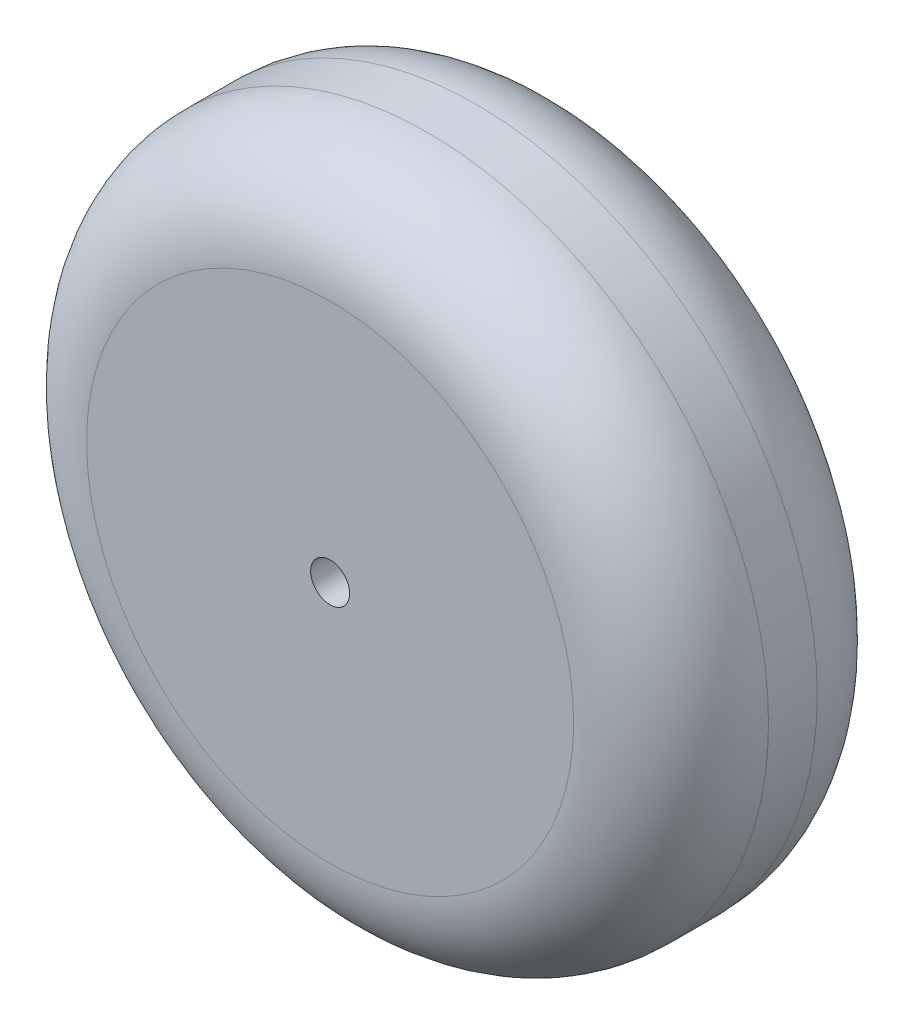
ISO-10303-21;
HEADER;
FILE_DESCRIPTION(('STEP AP214'),'2;1');
FILE_NAME('part.step','',(''),(''),'','','');
FILE_SCHEMA(('AUTOMOTIVE_DESIGN { 1 0 10303 214 1 1 1 1 }'));
ENDSEC;
DATA;
#1=APPLICATION_CONTEXT('core data for automotive mechanical design processes');
#2=APPLICATION_PROTOCOL_DEFINITION('international standard','automotive_design',2000,#1);
#3=PRODUCT_CONTEXT('',#1,'mechanical');
#4=PRODUCT('Part','Part','',(#3));
#5=PRODUCT_RELATED_PRODUCT_CATEGORY('part','',(#4));
#6=PRODUCT_DEFINITION_FORMATION('','',#4);
#7=PRODUCT_DEFINITION_CONTEXT('part definition',#1,'design');
#8=PRODUCT_DEFINITION('design','',#6,#7);
#9=PRODUCT_DEFINITION_SHAPE('','',#8);
#10=(LENGTH_UNIT() NAMED_UNIT(*) SI_UNIT(.MILLI.,.METRE.));
#11=(NAMED_UNIT(*) PLANE_ANGLE_UNIT() SI_UNIT($,.RADIAN.));
#12=(NAMED_UNIT(*) SI_UNIT($,.STERADIAN.) SOLID_ANGLE_UNIT());
#13=UNCERTAINTY_MEASURE_WITH_UNIT(LENGTH_MEASURE(1.E-05),#10,'distance_accuracy_value','');
#14=(GEOMETRIC_REPRESENTATION_CONTEXT(3) GLOBAL_UNCERTAINTY_ASSIGNED_CONTEXT((#13)) GLOBAL_UNIT_ASSIGNED_CONTEXT((#10,
#11,#12)) REPRESENTATION_CONTEXT('',''));
#15=CARTESIAN_POINT('',(0.,0.,0.));
#16=DIRECTION('',(0.,0.,1.));
#17=DIRECTION('',(1.,0.,0.));
#18=AXIS2_PLACEMENT_3D('',#15,#16,#17);
#19=CARTESIAN_POINT('',(0.,0.,25.));
#20=DIRECTION('',(0.,0.,-1.));
#21=DIRECTION('',(-1.,0.,0.));
#22=AXIS2_PLACEMENT_3D('',#19,#20,#21);
#23=CYLINDRICAL_SURFACE('',#22,35.);
#24=CARTESIAN_POINT('',(0.,0.,15.));
#25=DIRECTION('',(0.,0.,1.));
#26=DIRECTION('',(1.,0.,0.));
#27=AXIS2_PLACEMENT_3D('',#24,#25,#26);
#28=CIRCLE('',#27,35.);
#29=CARTESIAN_POINT('',(35.,0.,15.));
#30=VERTEX_POINT('',#29);
#31=EDGE_CURVE('E10',#30,#30,#28,.F.);
#32=ORIENTED_EDGE('',*,*,#31,.T.);
#33=EDGE_LOOP('',(#32));
#34=FACE_BOUND('',#33,.T.);
#35=CARTESIAN_POINT('',(0.,0.,10.));
#36=DIRECTION('',(0.,0.,1.));
#37=DIRECTION('',(1.,0.,0.));
#38=AXIS2_PLACEMENT_3D('',#35,#36,#37);
#39=CIRCLE('',#38,35.);
#40=CARTESIAN_POINT('',(35.,0.,10.));
#41=VERTEX_POINT('',#40);
#42=EDGE_CURVE('E55',#41,#41,#39,.T.);
#43=ORIENTED_EDGE('',*,*,#42,.T.);
#44=EDGE_LOOP('',(#43));
#45=FACE_BOUND('',#44,.T.);
#46=ADVANCED_FACE('F37',(#34,#45),#23,.T.);
#47=CARTESIAN_POINT('',(0.,0.,25.));
#48=DIRECTION('',(0.,0.,1.));
#49=DIRECTION('',(1.,0.,0.));
#50=AXIS2_PLACEMENT_3D('',#47,#48,#49);
#51=PLANE('',#50);
#52=CARTESIAN_POINT('',(0.,0.,25.));
#53=DIRECTION('',(0.,0.,1.));
#54=DIRECTION('',(1.,0.,0.));
#55=AXIS2_PLACEMENT_3D('',#52,#53,#54);
#56=CIRCLE('',#55,25.);
#57=CARTESIAN_POINT('',(25.,0.,25.));
#58=VERTEX_POINT('',#57);
#59=EDGE_CURVE('E45',#58,#58,#56,.T.);
#60=ORIENTED_EDGE('',*,*,#59,.T.);
#61=EDGE_LOOP('',(#60));
#62=FACE_BOUND('',#61,.T.);
#63=CARTESIAN_POINT('',(0.,0.,25.));
#64=DIRECTION('',(0.,0.,1.));
#65=DIRECTION('',(1.,0.,0.));
#66=AXIS2_PLACEMENT_3D('',#63,#64,#65);
#67=CIRCLE('',#66,2.);
#68=CARTESIAN_POINT('',(2.,0.,25.));
#69=VERTEX_POINT('',#68);
#70=EDGE_CURVE('E62',#69,#69,#67,.T.);
#71=ORIENTED_EDGE('',*,*,#70,.F.);
#72=EDGE_LOOP('',(#71));
#73=FACE_BOUND('',#72,.T.);
#74=ADVANCED_FACE('F79',(#62,#73),#51,.T.);
#75=CARTESIAN_POINT('',(0.,0.,0.));
#76=DIRECTION('',(0.,0.,1.));
#77=DIRECTION('',(1.,0.,0.));
#78=AXIS2_PLACEMENT_3D('',#75,#76,#77);
#79=PLANE('',#78);
#80=CARTESIAN_POINT('',(0.,0.,0.));
#81=DIRECTION('',(0.,0.,1.));
#82=DIRECTION('',(1.,0.,0.));
#83=AXIS2_PLACEMENT_3D('',#80,#81,#82);
#84=CIRCLE('',#83,25.);
#85=CARTESIAN_POINT('',(25.,0.,0.));
#86=VERTEX_POINT('',#85);
#87=EDGE_CURVE('E50',#86,#86,#84,.F.);
#88=ORIENTED_EDGE('',*,*,#87,.T.);
#89=EDGE_LOOP('',(#88));
#90=FACE_BOUND('',#89,.T.);
#91=ADVANCED_FACE('F75',(#90),#79,.F.);
#92=CARTESIAN_POINT('',(0.,0.,16.));
#93=DIRECTION('',(0.,0.,1.));
#94=DIRECTION('',(1.,0.,0.));
#95=AXIS2_PLACEMENT_3D('',#92,#93,#94);
#96=CYLINDRICAL_SURFACE('',#95,2.);
#97=CARTESIAN_POINT('',(0.,0.,16.));
#98=DIRECTION('',(0.,0.,1.));
#99=DIRECTION('',(1.,0.,0.));
#100=AXIS2_PLACEMENT_3D('',#97,#98,#99);
#101=CIRCLE('',#100,2.);
#102=CARTESIAN_POINT('',(2.,0.,16.));
#103=VERTEX_POINT('',#102);
#104=EDGE_CURVE('E61',#103,#103,#101,.T.);
#105=ORIENTED_EDGE('',*,*,#104,.F.);
#106=EDGE_LOOP('',(#105));
#107=FACE_BOUND('',#106,.T.);
#108=ORIENTED_EDGE('',*,*,#70,.T.);
#109=EDGE_LOOP('',(#108));
#110=FACE_BOUND('',#109,.T.);
#111=ADVANCED_FACE('F72',(#107,#110),#96,.F.);
#112=CARTESIAN_POINT('',(0.,0.,16.));
#113=DIRECTION('',(0.,0.,1.));
#114=DIRECTION('',(1.,0.,0.));
#115=AXIS2_PLACEMENT_3D('',#112,#113,#114);
#116=PLANE('',#115);
#117=ORIENTED_EDGE('',*,*,#104,.T.);
#118=EDGE_LOOP('',(#117));
#119=FACE_BOUND('',#118,.T.);
#120=ADVANCED_FACE('F70',(#119),#116,.T.);
#121=CARTESIAN_POINT('',(0.,0.,10.));
#122=DIRECTION('',(0.,0.,1.));
#123=DIRECTION('',(1.,0.,0.));
#124=AXIS2_PLACEMENT_3D('',#121,#122,#123);
#125=TOROIDAL_SURFACE('',#124,25.,10.);
#126=ORIENTED_EDGE('',*,*,#87,.F.);
#127=EDGE_LOOP('',(#126));
#128=FACE_BOUND('',#127,.T.);
#129=ORIENTED_EDGE('',*,*,#42,.F.);
#130=EDGE_LOOP('',(#129));
#131=FACE_BOUND('',#130,.T.);
#132=ADVANCED_FACE('F90',(#128,#131),#125,.T.);
#133=CARTESIAN_POINT('',(0.,0.,15.));
#134=DIRECTION('',(0.,0.,1.));
#135=DIRECTION('',(1.,0.,0.));
#136=AXIS2_PLACEMENT_3D('',#133,#134,#135);
#137=TOROIDAL_SURFACE('',#136,25.,10.);
#138=ORIENTED_EDGE('',*,*,#31,.F.);
#139=EDGE_LOOP('',(#138));
#140=FACE_BOUND('',#139,.T.);
#141=ORIENTED_EDGE('',*,*,#59,.F.);
#142=EDGE_LOOP('',(#141));
#143=FACE_BOUND('',#142,.T.);
#144=ADVANCED_FACE('F39',(#140,#143),#137,.T.);
#145=CLOSED_SHELL('',(#46,#74,#91,#111,#120,#132,#144));
#146=MANIFOLD_SOLID_BREP('B2',#145);
#147=ADVANCED_BREP_SHAPE_REPRESENTATION('',(#18,#146),#14);
#148=SHAPE_DEFINITION_REPRESENTATION(#9,#147);
ENDSEC;
END-ISO-10303-21;
